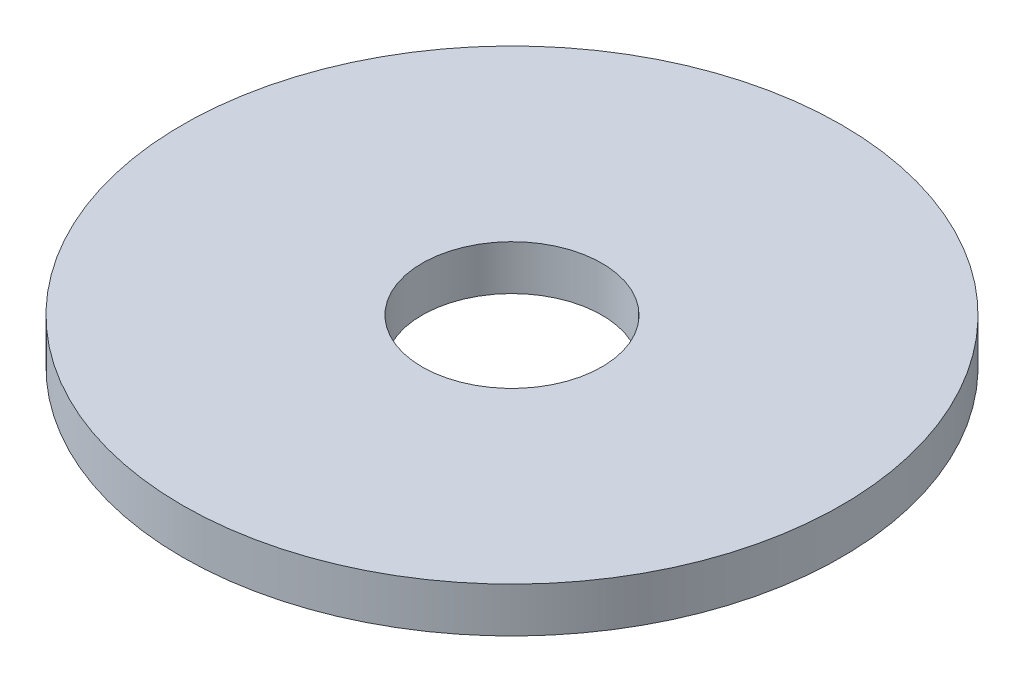
ISO-10303-21;
HEADER;
FILE_DESCRIPTION(('STEP AP214'),'2;1');
FILE_NAME('part.step','',(''),(''),'','','');
FILE_SCHEMA(('AUTOMOTIVE_DESIGN { 1 0 10303 214 1 1 1 1 }'));
ENDSEC;
DATA;
#1=APPLICATION_CONTEXT('core data for automotive mechanical design processes');
#2=APPLICATION_PROTOCOL_DEFINITION('international standard','automotive_design',2000,#1);
#3=PRODUCT_CONTEXT('',#1,'mechanical');
#4=PRODUCT('Part','Part','',(#3));
#5=PRODUCT_RELATED_PRODUCT_CATEGORY('part','',(#4));
#6=PRODUCT_DEFINITION_FORMATION('','',#4);
#7=PRODUCT_DEFINITION_CONTEXT('part definition',#1,'design');
#8=PRODUCT_DEFINITION('design','',#6,#7);
#9=PRODUCT_DEFINITION_SHAPE('','',#8);
#10=(LENGTH_UNIT() NAMED_UNIT(*) SI_UNIT(.MILLI.,.METRE.));
#11=(NAMED_UNIT(*) PLANE_ANGLE_UNIT() SI_UNIT($,.RADIAN.));
#12=(NAMED_UNIT(*) SI_UNIT($,.STERADIAN.) SOLID_ANGLE_UNIT());
#13=UNCERTAINTY_MEASURE_WITH_UNIT(LENGTH_MEASURE(1.E-05),#10,'distance_accuracy_value','');
#14=(GEOMETRIC_REPRESENTATION_CONTEXT(3) GLOBAL_UNCERTAINTY_ASSIGNED_CONTEXT((#13)) GLOBAL_UNIT_ASSIGNED_CONTEXT((#10,
#11,#12)) REPRESENTATION_CONTEXT('',''));
#15=CARTESIAN_POINT('',(0.,0.,0.));
#16=DIRECTION('',(0.,0.,1.));
#17=DIRECTION('',(1.,0.,0.));
#18=AXIS2_PLACEMENT_3D('',#15,#16,#17);
#19=CARTESIAN_POINT('',(0.,1.5,0.));
#20=DIRECTION('',(0.,1.,0.));
#21=DIRECTION('',(0.,0.,1.));
#22=AXIS2_PLACEMENT_3D('',#19,#20,#21);
#23=PLANE('',#22);
#24=CARTESIAN_POINT('',(0.,1.5,0.));
#25=DIRECTION('',(0.,1.,0.));
#26=DIRECTION('',(0.,0.,1.));
#27=AXIS2_PLACEMENT_3D('',#24,#25,#26);
#28=CIRCLE('',#27,11.);
#29=CARTESIAN_POINT('',(0.,1.5,11.));
#30=VERTEX_POINT('',#29);
#31=EDGE_CURVE('E10',#30,#30,#28,.T.);
#32=ORIENTED_EDGE('',*,*,#31,.T.);
#33=EDGE_LOOP('',(#32));
#34=FACE_BOUND('',#33,.T.);
#35=CARTESIAN_POINT('',(0.,1.5,0.));
#36=DIRECTION('',(0.,1.,0.));
#37=DIRECTION('',(0.,0.,1.));
#38=AXIS2_PLACEMENT_3D('',#35,#36,#37);
#39=CIRCLE('',#38,3.);
#40=CARTESIAN_POINT('',(0.,1.5,3.));
#41=VERTEX_POINT('',#40);
#42=EDGE_CURVE('E41',#41,#41,#39,.T.);
#43=ORIENTED_EDGE('',*,*,#42,.F.);
#44=EDGE_LOOP('',(#43));
#45=FACE_BOUND('',#44,.T.);
#46=ADVANCED_FACE('F30',(#34,#45),#23,.T.);
#47=CARTESIAN_POINT('',(0.,0.,0.));
#48=DIRECTION('',(0.,1.,0.));
#49=DIRECTION('',(0.,0.,1.));
#50=AXIS2_PLACEMENT_3D('',#47,#48,#49);
#51=PLANE('',#50);
#52=CARTESIAN_POINT('',(0.,0.,0.));
#53=DIRECTION('',(0.,1.,0.));
#54=DIRECTION('',(0.,0.,1.));
#55=AXIS2_PLACEMENT_3D('',#52,#53,#54);
#56=CIRCLE('',#55,11.);
#57=CARTESIAN_POINT('',(0.,0.,11.));
#58=VERTEX_POINT('',#57);
#59=EDGE_CURVE('E34',#58,#58,#56,.T.);
#60=ORIENTED_EDGE('',*,*,#59,.F.);
#61=EDGE_LOOP('',(#60));
#62=FACE_BOUND('',#61,.T.);
#63=CARTESIAN_POINT('',(0.,0.,0.));
#64=DIRECTION('',(0.,1.,0.));
#65=DIRECTION('',(0.,0.,1.));
#66=AXIS2_PLACEMENT_3D('',#63,#64,#65);
#67=CIRCLE('',#66,3.);
#68=CARTESIAN_POINT('',(0.,0.,3.));
#69=VERTEX_POINT('',#68);
#70=EDGE_CURVE('E43',#69,#69,#67,.T.);
#71=ORIENTED_EDGE('',*,*,#70,.T.);
#72=EDGE_LOOP('',(#71));
#73=FACE_BOUND('',#72,.T.);
#74=ADVANCED_FACE('F53',(#62,#73),#51,.F.);
#75=CARTESIAN_POINT('',(0.,1.5,0.));
#76=DIRECTION('',(0.,-1.,0.));
#77=DIRECTION('',(0.,0.,-1.));
#78=AXIS2_PLACEMENT_3D('',#75,#76,#77);
#79=CYLINDRICAL_SURFACE('',#78,11.);
#80=ORIENTED_EDGE('',*,*,#31,.F.);
#81=EDGE_LOOP('',(#80));
#82=FACE_BOUND('',#81,.T.);
#83=ORIENTED_EDGE('',*,*,#59,.T.);
#84=EDGE_LOOP('',(#83));
#85=FACE_BOUND('',#84,.T.);
#86=ADVANCED_FACE('F32',(#82,#85),#79,.T.);
#87=CARTESIAN_POINT('',(0.,1.5,0.));
#88=DIRECTION('',(0.,-1.,0.));
#89=DIRECTION('',(0.,0.,-1.));
#90=AXIS2_PLACEMENT_3D('',#87,#88,#89);
#91=CYLINDRICAL_SURFACE('',#90,3.);
#92=ORIENTED_EDGE('',*,*,#42,.T.);
#93=EDGE_LOOP('',(#92));
#94=FACE_BOUND('',#93,.T.);
#95=ORIENTED_EDGE('',*,*,#70,.F.);
#96=EDGE_LOOP('',(#95));
#97=FACE_BOUND('',#96,.T.);
#98=ADVANCED_FACE('F49',(#94,#97),#91,.F.);
#99=CLOSED_SHELL('',(#46,#74,#86,#98));
#100=MANIFOLD_SOLID_BREP('B2',#99);
#101=ADVANCED_BREP_SHAPE_REPRESENTATION('',(#18,#100),#14);
#102=SHAPE_DEFINITION_REPRESENTATION(#9,#101);
ENDSEC;
END-ISO-10303-21;
